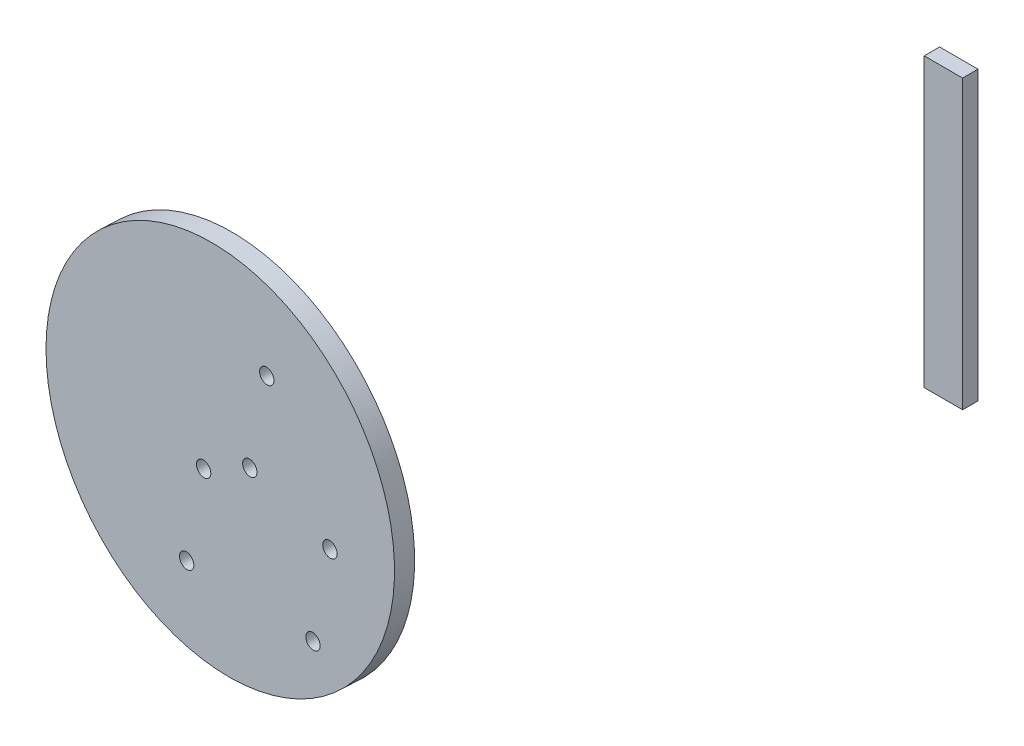
ISO-10303-21;
HEADER;
FILE_DESCRIPTION(('STEP AP214'),'2;1');
FILE_NAME('part.step','',(''),(''),'','','');
FILE_SCHEMA(('AUTOMOTIVE_DESIGN { 1 0 10303 214 1 1 1 1 }'));
ENDSEC;
DATA;
#1=APPLICATION_CONTEXT('core data for automotive mechanical design processes');
#2=APPLICATION_PROTOCOL_DEFINITION('international standard','automotive_design',2000,#1);
#3=PRODUCT_CONTEXT('',#1,'mechanical');
#4=PRODUCT('Part','Part','',(#3));
#5=PRODUCT_RELATED_PRODUCT_CATEGORY('part','',(#4));
#6=PRODUCT_DEFINITION_FORMATION('','',#4);
#7=PRODUCT_DEFINITION_CONTEXT('part definition',#1,'design');
#8=PRODUCT_DEFINITION('design','',#6,#7);
#9=PRODUCT_DEFINITION_SHAPE('','',#8);
#10=(LENGTH_UNIT() NAMED_UNIT(*) SI_UNIT(.MILLI.,.METRE.));
#11=(NAMED_UNIT(*) PLANE_ANGLE_UNIT() SI_UNIT($,.RADIAN.));
#12=(NAMED_UNIT(*) SI_UNIT($,.STERADIAN.) SOLID_ANGLE_UNIT());
#13=UNCERTAINTY_MEASURE_WITH_UNIT(LENGTH_MEASURE(1.E-05),#10,'distance_accuracy_value','');
#14=(GEOMETRIC_REPRESENTATION_CONTEXT(3) GLOBAL_UNCERTAINTY_ASSIGNED_CONTEXT((#13)) GLOBAL_UNIT_ASSIGNED_CONTEXT((#10,
#11,#12)) REPRESENTATION_CONTEXT('',''));
#15=CARTESIAN_POINT('',(0.,0.,0.));
#16=DIRECTION('',(0.,0.,1.));
#17=DIRECTION('',(1.,0.,0.));
#18=AXIS2_PLACEMENT_3D('',#15,#16,#17);
#19=CARTESIAN_POINT('',(25.1847167696356,-25.1712021696052,-74.4092149498314));
#20=DIRECTION('',(-0.0497213738686543,0.,0.998763127563595));
#21=DIRECTION('',(0.998763127563595,0.,0.0497213738686543));
#22=AXIS2_PLACEMENT_3D('',#19,#20,#21);
#23=CYLINDRICAL_SURFACE('',#22,1.24999999999997);
#24=CARTESIAN_POINT('',(25.1847167696356,-25.1712021696052,-74.4092149498314));
#25=DIRECTION('',(0.0497213738686544,0.,-0.998763127563595));
#26=DIRECTION('',(-0.998763127563595,0.,-0.0497213738686544));
#27=AXIS2_PLACEMENT_3D('',#24,#25,#26);
#28=CIRCLE('',#27,1.24999999999997);
#29=CARTESIAN_POINT('',(23.9362628601812,-25.1712021696052,-74.4713666671672));
#30=VERTEX_POINT('',#29);
#31=EDGE_CURVE('E51',#30,#30,#28,.T.);
#32=ORIENTED_EDGE('',*,*,#31,.T.);
#33=EDGE_LOOP('',(#32));
#34=FACE_BOUND('',#33,.T.);
#35=CARTESIAN_POINT('',(25.0268514076026,-25.1712021696052,-71.238142019817));
#36=DIRECTION('',(0.0497213738686544,0.,-0.998763127563595));
#37=DIRECTION('',(-0.998763127563595,0.,-0.0497213738686544));
#38=AXIS2_PLACEMENT_3D('',#35,#36,#37);
#39=CIRCLE('',#38,1.24999999999997);
#40=CARTESIAN_POINT('',(23.7783974981482,-25.1712021696052,-71.3002937371528));
#41=VERTEX_POINT('',#40);
#42=EDGE_CURVE('E74',#41,#41,#39,.T.);
#43=ORIENTED_EDGE('',*,*,#42,.F.);
#44=EDGE_LOOP('',(#43));
#45=FACE_BOUND('',#44,.T.);
#46=ADVANCED_FACE('F43',(#34,#45),#23,.F.);
#47=CARTESIAN_POINT('',(36.1696356282182,-6.1212021696052,-73.8623532942386));
#48=DIRECTION('',(-0.0497213738686543,0.,0.998763127563595));
#49=DIRECTION('',(0.998763127563595,0.,0.0497213738686543));
#50=AXIS2_PLACEMENT_3D('',#47,#48,#49);
#51=CYLINDRICAL_SURFACE('',#50,1.24999999999999);
#52=CARTESIAN_POINT('',(36.1696356282182,-6.1212021696052,-73.8623532942386));
#53=DIRECTION('',(0.0497213738686544,0.,-0.998763127563595));
#54=DIRECTION('',(-0.998763127563595,0.,-0.0497213738686544));
#55=AXIS2_PLACEMENT_3D('',#52,#53,#54);
#56=CIRCLE('',#55,1.24999999999999);
#57=CARTESIAN_POINT('',(34.9211817187637,-6.1212021696052,-73.9245050115744));
#58=VERTEX_POINT('',#57);
#59=EDGE_CURVE('E56',#58,#58,#56,.T.);
#60=ORIENTED_EDGE('',*,*,#59,.T.);
#61=EDGE_LOOP('',(#60));
#62=FACE_BOUND('',#61,.T.);
#63=CARTESIAN_POINT('',(36.0117702661852,-6.1212021696052,-70.6912803642242));
#64=DIRECTION('',(0.0497213738686544,0.,-0.998763127563595));
#65=DIRECTION('',(-0.998763127563595,0.,-0.0497213738686544));
#66=AXIS2_PLACEMENT_3D('',#63,#64,#65);
#67=CIRCLE('',#66,1.24999999999999);
#68=CARTESIAN_POINT('',(34.7633163567307,-6.1212021696052,-70.75343208156));
#69=VERTEX_POINT('',#68);
#70=EDGE_CURVE('E72',#69,#69,#67,.T.);
#71=ORIENTED_EDGE('',*,*,#70,.F.);
#72=EDGE_LOOP('',(#71));
#73=FACE_BOUND('',#72,.T.);
#74=ADVANCED_FACE('F98',(#62,#73),#51,.F.);
#75=CARTESIAN_POINT('',(22.2344967974361,-39.877480799077,-74.5560856003232));
#76=DIRECTION('',(-0.0497213738686543,0.,0.998763127563595));
#77=DIRECTION('',(0.998763127563595,0.,0.0497213738686543));
#78=AXIS2_PLACEMENT_3D('',#75,#76,#77);
#79=CYLINDRICAL_SURFACE('',#78,1.24999999999996);
#80=CARTESIAN_POINT('',(22.2344967974361,-39.877480799077,-74.5560856003232));
#81=DIRECTION('',(0.0497213738686544,0.,-0.998763127563595));
#82=DIRECTION('',(-0.998763127563595,0.,-0.0497213738686544));
#83=AXIS2_PLACEMENT_3D('',#80,#81,#82);
#84=CIRCLE('',#83,1.24999999999996);
#85=CARTESIAN_POINT('',(20.9860428879817,-39.877480799077,-74.618237317659));
#86=VERTEX_POINT('',#85);
#87=EDGE_CURVE('E93',#86,#86,#84,.T.);
#88=ORIENTED_EDGE('',*,*,#87,.T.);
#89=EDGE_LOOP('',(#88));
#90=FACE_BOUND('',#89,.T.);
#91=CARTESIAN_POINT('',(22.0766314354032,-39.877480799077,-71.3850126703088));
#92=DIRECTION('',(0.0497213738686544,0.,-0.998763127563595));
#93=DIRECTION('',(-0.998763127563595,0.,-0.0497213738686544));
#94=AXIS2_PLACEMENT_3D('',#91,#92,#93);
#95=CIRCLE('',#94,1.24999999999996);
#96=CARTESIAN_POINT('',(20.8281775259487,-39.877480799077,-71.4471643876446));
#97=VERTEX_POINT('',#96);
#98=EDGE_CURVE('E69',#97,#97,#95,.T.);
#99=ORIENTED_EDGE('',*,*,#98,.F.);
#100=EDGE_LOOP('',(#99));
#101=FACE_BOUND('',#100,.T.);
#102=ADVANCED_FACE('F116',(#90,#101),#79,.F.);
#103=CARTESIAN_POINT('',(47.1545544868007,-25.1712021696052,-73.3154916386459));
#104=DIRECTION('',(-0.0497213738686543,0.,0.998763127563595));
#105=DIRECTION('',(0.998763127563595,0.,0.0497213738686543));
#106=AXIS2_PLACEMENT_3D('',#103,#104,#105);
#107=CYLINDRICAL_SURFACE('',#106,1.25);
#108=CARTESIAN_POINT('',(47.1545544868007,-25.1712021696052,-73.3154916386459));
#109=DIRECTION('',(0.0497213738686544,0.,-0.998763127563595));
#110=DIRECTION('',(-0.998763127563595,0.,-0.0497213738686544));
#111=AXIS2_PLACEMENT_3D('',#108,#109,#110);
#112=CIRCLE('',#111,1.25);
#113=CARTESIAN_POINT('',(45.9061005773462,-25.1712021696052,-73.3776433559817));
#114=VERTEX_POINT('',#113);
#115=EDGE_CURVE('E88',#114,#114,#112,.F.);
#116=ORIENTED_EDGE('',*,*,#115,.F.);
#117=EDGE_LOOP('',(#116));
#118=FACE_BOUND('',#117,.T.);
#119=CARTESIAN_POINT('',(46.9966891247677,-25.1712021696052,-70.1444187086315));
#120=DIRECTION('',(0.0497213738686544,0.,-0.998763127563595));
#121=DIRECTION('',(-0.998763127563595,0.,-0.0497213738686544));
#122=AXIS2_PLACEMENT_3D('',#119,#120,#121);
#123=CIRCLE('',#122,1.25);
#124=CARTESIAN_POINT('',(45.7482352153132,-25.1712021696052,-70.2065704259673));
#125=VERTEX_POINT('',#124);
#126=EDGE_CURVE('E66',#125,#125,#123,.F.);
#127=ORIENTED_EDGE('',*,*,#126,.T.);
#128=EDGE_LOOP('',(#127));
#129=FACE_BOUND('',#128,.T.);
#130=ADVANCED_FACE('F123',(#118,#129),#107,.F.);
#131=CARTESIAN_POINT('',(44.2043345146012,-39.877480799077,-73.4623622891377));
#132=DIRECTION('',(-0.0497213738686543,0.,0.998763127563595));
#133=DIRECTION('',(0.998763127563595,0.,0.0497213738686543));
#134=AXIS2_PLACEMENT_3D('',#131,#132,#133);
#135=CYLINDRICAL_SURFACE('',#134,1.25);
#136=CARTESIAN_POINT('',(44.2043345146012,-39.877480799077,-73.4623622891377));
#137=DIRECTION('',(0.0497213738686544,0.,-0.998763127563595));
#138=DIRECTION('',(-0.998763127563595,0.,-0.0497213738686544));
#139=AXIS2_PLACEMENT_3D('',#136,#137,#138);
#140=CIRCLE('',#139,1.25);
#141=CARTESIAN_POINT('',(42.9558806051467,-39.877480799077,-73.5245140064735));
#142=VERTEX_POINT('',#141);
#143=EDGE_CURVE('E83',#142,#142,#140,.F.);
#144=ORIENTED_EDGE('',*,*,#143,.F.);
#145=EDGE_LOOP('',(#144));
#146=FACE_BOUND('',#145,.T.);
#147=CARTESIAN_POINT('',(44.0464691525682,-39.877480799077,-70.2912893591233));
#148=DIRECTION('',(0.0497213738686544,0.,-0.998763127563595));
#149=DIRECTION('',(-0.998763127563595,0.,-0.0497213738686544));
#150=AXIS2_PLACEMENT_3D('',#147,#148,#149);
#151=CIRCLE('',#150,1.25);
#152=CARTESIAN_POINT('',(42.7980152431137,-39.877480799077,-70.3534410764591));
#153=VERTEX_POINT('',#152);
#154=EDGE_CURVE('E63',#153,#153,#151,.F.);
#155=ORIENTED_EDGE('',*,*,#154,.T.);
#156=EDGE_LOOP('',(#155));
#157=FACE_BOUND('',#156,.T.);
#158=ADVANCED_FACE('F126',(#146,#157),#135,.F.);
#159=CARTESIAN_POINT('',(28.076878381242,-22.3489094854753,-74.2652346157455));
#160=DIRECTION('',(-0.0497213738686543,0.,0.998763127563595));
#161=DIRECTION('',(0.998763127563595,0.,0.0497213738686543));
#162=AXIS2_PLACEMENT_3D('',#159,#160,#161);
#163=CYLINDRICAL_SURFACE('',#162,30.3508639977315);
#164=CARTESIAN_POINT('',(28.076878381242,-22.3489094854753,-74.2652346157455));
#165=DIRECTION('',(0.0497213738686544,0.,-0.998763127563595));
#166=DIRECTION('',(-0.998763127563595,0.,-0.0497213738686544));
#167=AXIS2_PLACEMENT_3D('',#164,#165,#166);
#168=CIRCLE('',#167,30.3508639977315);
#169=CARTESIAN_POINT('',(-2.23644546938968,-22.3489094854753,-75.7743212718134));
#170=VERTEX_POINT('',#169);
#171=EDGE_CURVE('E79',#170,#170,#168,.T.);
#172=ORIENTED_EDGE('',*,*,#171,.F.);
#173=EDGE_LOOP('',(#172));
#174=FACE_BOUND('',#173,.T.);
#175=CARTESIAN_POINT('',(27.919013019209,-22.3489094854753,-71.0941616857311));
#176=DIRECTION('',(0.0497213738686544,0.,-0.998763127563595));
#177=DIRECTION('',(-0.998763127563595,0.,-0.0497213738686544));
#178=AXIS2_PLACEMENT_3D('',#175,#176,#177);
#179=CIRCLE('',#178,30.3508639977315);
#180=CARTESIAN_POINT('',(-2.39431083142266,-22.3489094854753,-72.603248341799));
#181=VERTEX_POINT('',#180);
#182=EDGE_CURVE('E60',#181,#181,#179,.T.);
#183=ORIENTED_EDGE('',*,*,#182,.T.);
#184=EDGE_LOOP('',(#183));
#185=FACE_BOUND('',#184,.T.);
#186=ADVANCED_FACE('F45',(#174,#185),#163,.T.);
#187=CARTESIAN_POINT('',(33.2194156560187,-20.827480799077,-74.0092239447304));
#188=DIRECTION('',(-0.0497213738686543,0.,0.998763127563595));
#189=DIRECTION('',(0.998763127563595,0.,0.0497213738686543));
#190=AXIS2_PLACEMENT_3D('',#187,#188,#189);
#191=CYLINDRICAL_SURFACE('',#190,1.24999999999999);
#192=CARTESIAN_POINT('',(33.2194156560187,-20.827480799077,-74.0092239447304));
#193=DIRECTION('',(0.0497213738686544,0.,-0.998763127563595));
#194=DIRECTION('',(-0.998763127563595,0.,-0.0497213738686544));
#195=AXIS2_PLACEMENT_3D('',#192,#193,#194);
#196=CIRCLE('',#195,1.24999999999999);
#197=CARTESIAN_POINT('',(31.9709617465642,-20.827480799077,-74.0713756620662));
#198=VERTEX_POINT('',#197);
#199=EDGE_CURVE('E11',#198,#198,#196,.T.);
#200=ORIENTED_EDGE('',*,*,#199,.T.);
#201=EDGE_LOOP('',(#200));
#202=FACE_BOUND('',#201,.T.);
#203=CARTESIAN_POINT('',(33.0615502939857,-20.827480799077,-70.838151014716));
#204=DIRECTION('',(0.0497213738686544,0.,-0.998763127563595));
#205=DIRECTION('',(-0.998763127563595,0.,-0.0497213738686544));
#206=AXIS2_PLACEMENT_3D('',#203,#204,#205);
#207=CIRCLE('',#206,1.24999999999999);
#208=CARTESIAN_POINT('',(31.8130963845312,-20.827480799077,-70.9003027320518));
#209=VERTEX_POINT('',#208);
#210=EDGE_CURVE('E47',#209,#209,#207,.T.);
#211=ORIENTED_EDGE('',*,*,#210,.F.);
#212=EDGE_LOOP('',(#211));
#213=FACE_BOUND('',#212,.T.);
#214=ADVANCED_FACE('F105',(#202,#213),#191,.F.);
#215=CARTESIAN_POINT('',(3.75741433877558,0.,-75.4759292545139));
#216=DIRECTION('',(0.0497213738686544,0.,-0.998763127563595));
#217=DIRECTION('',(-0.998763127563595,0.,-0.0497213738686544));
#218=AXIS2_PLACEMENT_3D('',#215,#216,#217);
#219=PLANE('',#218);
#220=ORIENTED_EDGE('',*,*,#171,.T.);
#221=EDGE_LOOP('',(#220));
#222=FACE_BOUND('',#221,.T.);
#223=ORIENTED_EDGE('',*,*,#143,.T.);
#224=EDGE_LOOP('',(#223));
#225=FACE_BOUND('',#224,.T.);
#226=ORIENTED_EDGE('',*,*,#115,.T.);
#227=EDGE_LOOP('',(#226));
#228=FACE_BOUND('',#227,.T.);
#229=ORIENTED_EDGE('',*,*,#87,.F.);
#230=EDGE_LOOP('',(#229));
#231=FACE_BOUND('',#230,.T.);
#232=ORIENTED_EDGE('',*,*,#59,.F.);
#233=EDGE_LOOP('',(#232));
#234=FACE_BOUND('',#233,.T.);
#235=ORIENTED_EDGE('',*,*,#31,.F.);
#236=EDGE_LOOP('',(#235));
#237=FACE_BOUND('',#236,.T.);
#238=ORIENTED_EDGE('',*,*,#199,.F.);
#239=EDGE_LOOP('',(#238));
#240=FACE_BOUND('',#239,.T.);
#241=ADVANCED_FACE('F101',(#222,#225,#228,#231,#234,#237,#240),#219,.T.);
#242=CARTESIAN_POINT('',(3.5995489767426,0.,-72.3048563244995));
#243=DIRECTION('',(0.0497213738686544,0.,-0.998763127563595));
#244=DIRECTION('',(-0.998763127563595,0.,-0.0497213738686544));
#245=AXIS2_PLACEMENT_3D('',#242,#243,#244);
#246=PLANE('',#245);
#247=ORIENTED_EDGE('',*,*,#182,.F.);
#248=EDGE_LOOP('',(#247));
#249=FACE_BOUND('',#248,.T.);
#250=ORIENTED_EDGE('',*,*,#154,.F.);
#251=EDGE_LOOP('',(#250));
#252=FACE_BOUND('',#251,.T.);
#253=ORIENTED_EDGE('',*,*,#126,.F.);
#254=EDGE_LOOP('',(#253));
#255=FACE_BOUND('',#254,.T.);
#256=ORIENTED_EDGE('',*,*,#98,.T.);
#257=EDGE_LOOP('',(#256));
#258=FACE_BOUND('',#257,.T.);
#259=ORIENTED_EDGE('',*,*,#70,.T.);
#260=EDGE_LOOP('',(#259));
#261=FACE_BOUND('',#260,.T.);
#262=ORIENTED_EDGE('',*,*,#42,.T.);
#263=EDGE_LOOP('',(#262));
#264=FACE_BOUND('',#263,.T.);
#265=ORIENTED_EDGE('',*,*,#210,.T.);
#266=EDGE_LOOP('',(#265));
#267=FACE_BOUND('',#266,.T.);
#268=ADVANCED_FACE('F104',(#249,#252,#255,#258,#261,#264,#267),#246,.F.);
#269=CLOSED_SHELL('',(#46,#74,#102,#130,#158,#186,#214,#241,#268));
#270=MANIFOLD_SOLID_BREP('B2',#269);
#271=CARTESIAN_POINT('',(56.5975829808799,5.95665851565893,-158.77988535882));
#272=DIRECTION('',(1.,0.,0.));
#273=DIRECTION('',(0.,1.,0.));
#274=AXIS2_PLACEMENT_3D('',#271,#272,#273);
#275=PLANE('',#274);
#276=DIRECTION('',(0.,-1.,0.));
#277=VECTOR('',#276,1.);
#278=CARTESIAN_POINT('',(56.5975829808799,5.95665851565893,-161.31988535882));
#279=LINE('',#278,#277);
#280=CARTESIAN_POINT('',(56.5975829808799,5.95665851565893,-161.31988535882));
#281=VERTEX_POINT('',#280);
#282=CARTESIAN_POINT('',(56.5975829808799,-41.5413414843411,-161.31988535882));
#283=VERTEX_POINT('',#282);
#284=EDGE_CURVE('E333',#281,#283,#279,.T.);
#285=ORIENTED_EDGE('',*,*,#284,.T.);
#286=DIRECTION('',(0.,0.,-1.));
#287=VECTOR('',#286,1.);
#288=CARTESIAN_POINT('',(56.5975829808799,-41.5413414843411,-158.77988535882));
#289=LINE('',#288,#287);
#290=CARTESIAN_POINT('',(56.5975829808799,-41.5413414843411,-158.77988535882));
#291=VERTEX_POINT('',#290);
#292=EDGE_CURVE('E41',#291,#283,#289,.T.);
#293=ORIENTED_EDGE('',*,*,#292,.F.);
#294=DIRECTION('',(0.,-1.,0.));
#295=VECTOR('',#294,1.);
#296=CARTESIAN_POINT('',(56.5975829808799,5.95665851565893,-158.77988535882));
#297=LINE('',#296,#295);
#298=CARTESIAN_POINT('',(56.5975829808799,5.95665851565893,-158.77988535882));
#299=VERTEX_POINT('',#298);
#300=EDGE_CURVE('E321',#299,#291,#297,.T.);
#301=ORIENTED_EDGE('',*,*,#300,.F.);
#302=DIRECTION('',(0.,0.,-1.));
#303=VECTOR('',#302,1.);
#304=CARTESIAN_POINT('',(56.5975829808799,5.95665851565893,-158.77988535882));
#305=LINE('',#304,#303);
#306=EDGE_CURVE('E329',#299,#281,#305,.T.);
#307=ORIENTED_EDGE('',*,*,#306,.T.);
#308=EDGE_LOOP('',(#285,#293,#301,#307));
#309=FACE_BOUND('',#308,.T.);
#310=ADVANCED_FACE('F270',(#309),#275,.F.);
#311=CARTESIAN_POINT('',(56.5975829808799,-41.5413414843411,-158.77988535882));
#312=DIRECTION('',(0.,1.,0.));
#313=DIRECTION('',(0.,0.,1.));
#314=AXIS2_PLACEMENT_3D('',#311,#312,#313);
#315=PLANE('',#314);
#316=DIRECTION('',(1.,0.,0.));
#317=VECTOR('',#316,1.);
#318=CARTESIAN_POINT('',(56.5975829808799,-41.5413414843411,-161.31988535882));
#319=LINE('',#318,#317);
#320=CARTESIAN_POINT('',(62.9475829808799,-41.5413414843411,-161.31988535882));
#321=VERTEX_POINT('',#320);
#322=EDGE_CURVE('E325',#283,#321,#319,.T.);
#323=ORIENTED_EDGE('',*,*,#322,.T.);
#324=DIRECTION('',(0.,0.,-1.));
#325=VECTOR('',#324,1.);
#326=CARTESIAN_POINT('',(62.9475829808799,-41.5413414843411,-158.77988535882));
#327=LINE('',#326,#325);
#328=CARTESIAN_POINT('',(62.9475829808799,-41.5413414843411,-158.77988535882));
#329=VERTEX_POINT('',#328);
#330=EDGE_CURVE('E278',#329,#321,#327,.T.);
#331=ORIENTED_EDGE('',*,*,#330,.F.);
#332=DIRECTION('',(1.,0.,0.));
#333=VECTOR('',#332,1.);
#334=CARTESIAN_POINT('',(56.5975829808799,-41.5413414843411,-158.77988535882));
#335=LINE('',#334,#333);
#336=EDGE_CURVE('E316',#291,#329,#335,.T.);
#337=ORIENTED_EDGE('',*,*,#336,.F.);
#338=ORIENTED_EDGE('',*,*,#292,.T.);
#339=EDGE_LOOP('',(#323,#331,#337,#338));
#340=FACE_BOUND('',#339,.T.);
#341=ADVANCED_FACE('F324',(#340),#315,.F.);
#342=CARTESIAN_POINT('',(62.9475829808799,5.95665851565893,-158.77988535882));
#343=DIRECTION('',(-1.,0.,0.));
#344=DIRECTION('',(0.,0.,1.));
#345=AXIS2_PLACEMENT_3D('',#342,#343,#344);
#346=PLANE('',#345);
#347=DIRECTION('',(0.,1.,0.));
#348=VECTOR('',#347,1.);
#349=CARTESIAN_POINT('',(62.9475829808799,5.95665851565893,-161.31988535882));
#350=LINE('',#349,#348);
#351=CARTESIAN_POINT('',(62.9475829808799,5.95665851565893,-161.31988535882));
#352=VERTEX_POINT('',#351);
#353=EDGE_CURVE('E303',#321,#352,#350,.T.);
#354=ORIENTED_EDGE('',*,*,#353,.T.);
#355=DIRECTION('',(0.,0.,-1.));
#356=VECTOR('',#355,1.);
#357=CARTESIAN_POINT('',(62.9475829808799,5.95665851565893,-158.77988535882));
#358=LINE('',#357,#356);
#359=CARTESIAN_POINT('',(62.9475829808799,5.95665851565893,-158.77988535882));
#360=VERTEX_POINT('',#359);
#361=EDGE_CURVE('E326',#360,#352,#358,.T.);
#362=ORIENTED_EDGE('',*,*,#361,.F.);
#363=DIRECTION('',(0.,1.,0.));
#364=VECTOR('',#363,1.);
#365=CARTESIAN_POINT('',(62.9475829808799,5.95665851565893,-158.77988535882));
#366=LINE('',#365,#364);
#367=EDGE_CURVE('E319',#329,#360,#366,.T.);
#368=ORIENTED_EDGE('',*,*,#367,.F.);
#369=ORIENTED_EDGE('',*,*,#330,.T.);
#370=EDGE_LOOP('',(#354,#362,#368,#369));
#371=FACE_BOUND('',#370,.T.);
#372=ADVANCED_FACE('F327',(#371),#346,.F.);
#373=CARTESIAN_POINT('',(56.5975829808799,5.95665851565893,-158.77988535882));
#374=DIRECTION('',(0.,-1.,0.));
#375=DIRECTION('',(0.,0.,-1.));
#376=AXIS2_PLACEMENT_3D('',#373,#374,#375);
#377=PLANE('',#376);
#378=DIRECTION('',(-1.,0.,0.));
#379=VECTOR('',#378,1.);
#380=CARTESIAN_POINT('',(56.5975829808799,5.95665851565893,-161.31988535882));
#381=LINE('',#380,#379);
#382=EDGE_CURVE('E309',#352,#281,#381,.T.);
#383=ORIENTED_EDGE('',*,*,#382,.T.);
#384=ORIENTED_EDGE('',*,*,#306,.F.);
#385=DIRECTION('',(-1.,0.,0.));
#386=VECTOR('',#385,1.);
#387=CARTESIAN_POINT('',(56.5975829808799,5.95665851565893,-158.77988535882));
#388=LINE('',#387,#386);
#389=EDGE_CURVE('E286',#360,#299,#388,.T.);
#390=ORIENTED_EDGE('',*,*,#389,.F.);
#391=ORIENTED_EDGE('',*,*,#361,.T.);
#392=EDGE_LOOP('',(#383,#384,#390,#391));
#393=FACE_BOUND('',#392,.T.);
#394=ADVANCED_FACE('F340',(#393),#377,.F.);
#395=CARTESIAN_POINT('',(0.,0.,-158.77988535882));
#396=DIRECTION('',(0.,0.,1.));
#397=DIRECTION('',(1.,0.,0.));
#398=AXIS2_PLACEMENT_3D('',#395,#396,#397);
#399=PLANE('',#398);
#400=ORIENTED_EDGE('',*,*,#300,.T.);
#401=ORIENTED_EDGE('',*,*,#336,.T.);
#402=ORIENTED_EDGE('',*,*,#367,.T.);
#403=ORIENTED_EDGE('',*,*,#389,.T.);
#404=EDGE_LOOP('',(#400,#401,#402,#403));
#405=FACE_BOUND('',#404,.T.);
#406=ADVANCED_FACE('F317',(#405),#399,.T.);
#407=CARTESIAN_POINT('',(0.,0.,-161.31988535882));
#408=DIRECTION('',(0.,0.,1.));
#409=DIRECTION('',(1.,0.,0.));
#410=AXIS2_PLACEMENT_3D('',#407,#408,#409);
#411=PLANE('',#410);
#412=ORIENTED_EDGE('',*,*,#284,.F.);
#413=ORIENTED_EDGE('',*,*,#382,.F.);
#414=ORIENTED_EDGE('',*,*,#353,.F.);
#415=ORIENTED_EDGE('',*,*,#322,.F.);
#416=EDGE_LOOP('',(#412,#413,#414,#415));
#417=FACE_BOUND('',#416,.T.);
#418=ADVANCED_FACE('F343',(#417),#411,.F.);
#419=CLOSED_SHELL('',(#310,#341,#372,#394,#406,#418));
#420=MANIFOLD_SOLID_BREP('B6',#419);
#421=ADVANCED_BREP_SHAPE_REPRESENTATION('',(#18,#270,#420),#14);
#422=SHAPE_DEFINITION_REPRESENTATION(#9,#421);
ENDSEC;
END-ISO-10303-21;
